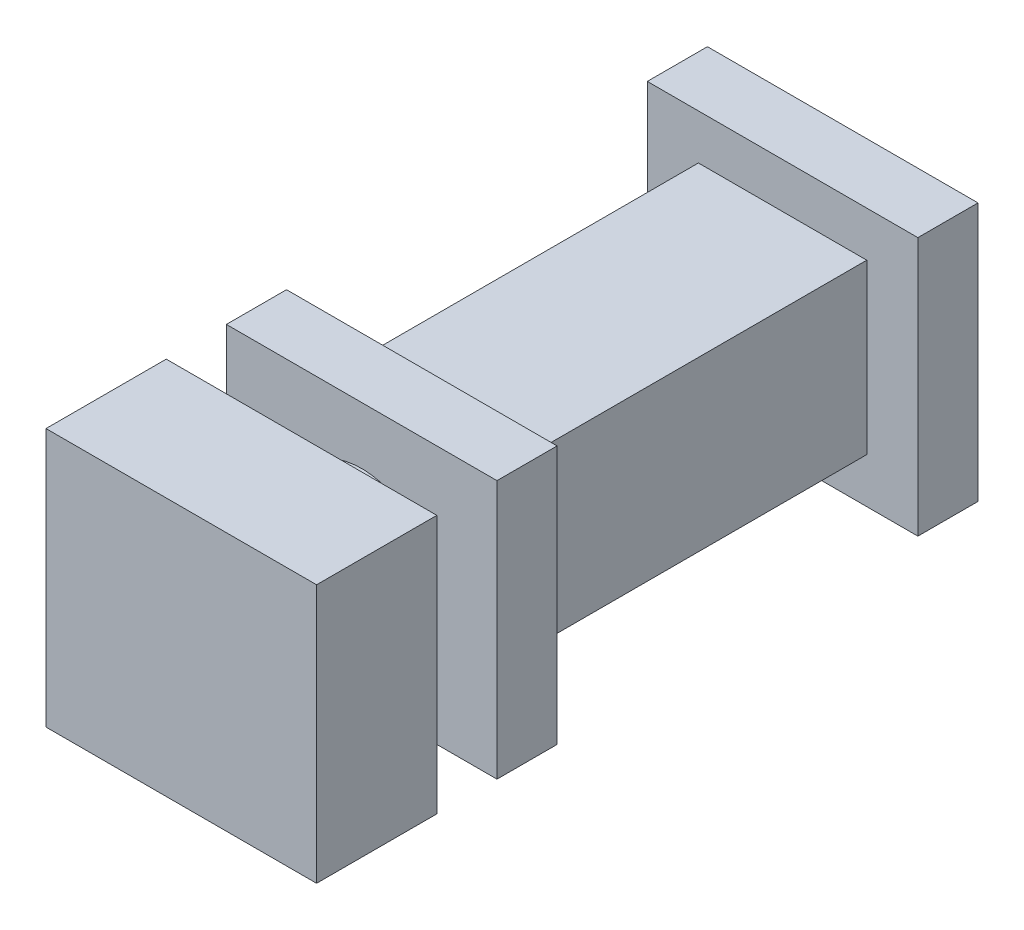
ISO-10303-21;
HEADER;
FILE_DESCRIPTION(('STEP AP214'),'2;1');
FILE_NAME('part.step','',(''),(''),'','','');
FILE_SCHEMA(('AUTOMOTIVE_DESIGN { 1 0 10303 214 1 1 1 1 }'));
ENDSEC;
DATA;
#1=APPLICATION_CONTEXT('core data for automotive mechanical design processes');
#2=APPLICATION_PROTOCOL_DEFINITION('international standard','automotive_design',2000,#1);
#3=PRODUCT_CONTEXT('',#1,'mechanical');
#4=PRODUCT('Part','Part','',(#3));
#5=PRODUCT_RELATED_PRODUCT_CATEGORY('part','',(#4));
#6=PRODUCT_DEFINITION_FORMATION('','',#4);
#7=PRODUCT_DEFINITION_CONTEXT('part definition',#1,'design');
#8=PRODUCT_DEFINITION('design','',#6,#7);
#9=PRODUCT_DEFINITION_SHAPE('','',#8);
#10=(LENGTH_UNIT() NAMED_UNIT(*) SI_UNIT(.MILLI.,.METRE.));
#11=(NAMED_UNIT(*) PLANE_ANGLE_UNIT() SI_UNIT($,.RADIAN.));
#12=(NAMED_UNIT(*) SI_UNIT($,.STERADIAN.) SOLID_ANGLE_UNIT());
#13=UNCERTAINTY_MEASURE_WITH_UNIT(LENGTH_MEASURE(1.E-05),#10,'distance_accuracy_value','');
#14=(GEOMETRIC_REPRESENTATION_CONTEXT(3) GLOBAL_UNCERTAINTY_ASSIGNED_CONTEXT((#13)) GLOBAL_UNIT_ASSIGNED_CONTEXT((#10,
#11,#12)) REPRESENTATION_CONTEXT('',''));
#15=CARTESIAN_POINT('',(0.,0.,0.));
#16=DIRECTION('',(0.,0.,1.));
#17=DIRECTION('',(1.,0.,0.));
#18=AXIS2_PLACEMENT_3D('',#15,#16,#17);
#19=CARTESIAN_POINT('',(0.,0.,-1.));
#20=DIRECTION('',(0.,0.,1.));
#21=DIRECTION('',(1.,0.,0.));
#22=AXIS2_PLACEMENT_3D('',#19,#20,#21);
#23=PLANE('',#22);
#24=DIRECTION('',(0.,1.,0.));
#25=VECTOR('',#24,1.);
#26=CARTESIAN_POINT('',(-1.125,-1.075,-1.));
#27=LINE('',#26,#25);
#28=CARTESIAN_POINT('',(-1.125,-1.075,-1.));
#29=VERTEX_POINT('',#28);
#30=CARTESIAN_POINT('',(-1.125,1.075,-1.));
#31=VERTEX_POINT('',#30);
#32=EDGE_CURVE('E230',#29,#31,#27,.T.);
#33=ORIENTED_EDGE('',*,*,#32,.T.);
#34=DIRECTION('',(1.,0.,0.));
#35=VECTOR('',#34,1.);
#36=CARTESIAN_POINT('',(1.125,1.075,-1.));
#37=LINE('',#36,#35);
#38=CARTESIAN_POINT('',(1.125,1.075,-1.));
#39=VERTEX_POINT('',#38);
#40=EDGE_CURVE('E234',#31,#39,#37,.T.);
#41=ORIENTED_EDGE('',*,*,#40,.T.);
#42=DIRECTION('',(0.,-1.,0.));
#43=VECTOR('',#42,1.);
#44=CARTESIAN_POINT('',(1.125,-1.075,-1.));
#45=LINE('',#44,#43);
#46=CARTESIAN_POINT('',(1.125,-1.075,-1.));
#47=VERTEX_POINT('',#46);
#48=EDGE_CURVE('E238',#39,#47,#45,.T.);
#49=ORIENTED_EDGE('',*,*,#48,.T.);
#50=DIRECTION('',(-1.,0.,0.));
#51=VECTOR('',#50,1.);
#52=CARTESIAN_POINT('',(1.125,-1.075,-1.));
#53=LINE('',#52,#51);
#54=EDGE_CURVE('E241',#47,#29,#53,.T.);
#55=ORIENTED_EDGE('',*,*,#54,.T.);
#56=EDGE_LOOP('',(#33,#41,#49,#55));
#57=FACE_BOUND('',#56,.T.);
#58=DIRECTION('',(0.,1.,0.));
#59=VECTOR('',#58,1.);
#60=CARTESIAN_POINT('',(-0.7,-0.7,-1.));
#61=LINE('',#60,#59);
#62=CARTESIAN_POINT('',(-0.7,-0.7,-1.));
#63=VERTEX_POINT('',#62);
#64=CARTESIAN_POINT('',(-0.7,0.7,-1.));
#65=VERTEX_POINT('',#64);
#66=EDGE_CURVE('E56',#63,#65,#61,.T.);
#67=ORIENTED_EDGE('',*,*,#66,.F.);
#68=DIRECTION('',(-1.,0.,0.));
#69=VECTOR('',#68,1.);
#70=CARTESIAN_POINT('',(0.7,-0.7,-1.));
#71=LINE('',#70,#69);
#72=CARTESIAN_POINT('',(0.7,-0.7,-1.));
#73=VERTEX_POINT('',#72);
#74=EDGE_CURVE('E60',#73,#63,#71,.T.);
#75=ORIENTED_EDGE('',*,*,#74,.F.);
#76=DIRECTION('',(0.,-1.,0.));
#77=VECTOR('',#76,1.);
#78=CARTESIAN_POINT('',(0.7,-0.7,-1.));
#79=LINE('',#78,#77);
#80=CARTESIAN_POINT('',(0.7,0.7,-1.));
#81=VERTEX_POINT('',#80);
#82=EDGE_CURVE('E209',#81,#73,#79,.T.);
#83=ORIENTED_EDGE('',*,*,#82,.F.);
#84=DIRECTION('',(1.,0.,0.));
#85=VECTOR('',#84,1.);
#86=CARTESIAN_POINT('',(0.7,0.7,-1.));
#87=LINE('',#86,#85);
#88=EDGE_CURVE('E183',#65,#81,#87,.T.);
#89=ORIENTED_EDGE('',*,*,#88,.F.);
#90=EDGE_LOOP('',(#67,#75,#83,#89));
#91=FACE_BOUND('',#90,.T.);
#92=ADVANCED_FACE('F39',(#57,#91),#23,.F.);
#93=CARTESIAN_POINT('',(1.125,-1.075,1.));
#94=DIRECTION('',(-1.,0.,0.));
#95=DIRECTION('',(0.,-1.,0.));
#96=AXIS2_PLACEMENT_3D('',#93,#94,#95);
#97=PLANE('',#96);
#98=DIRECTION('',(0.,1.,0.));
#99=VECTOR('',#98,1.);
#100=CARTESIAN_POINT('',(1.125,-1.075,0.));
#101=LINE('',#100,#99);
#102=CARTESIAN_POINT('',(1.125,-1.075,0.));
#103=VERTEX_POINT('',#102);
#104=CARTESIAN_POINT('',(1.125,1.075,0.));
#105=VERTEX_POINT('',#104);
#106=EDGE_CURVE('E274',#103,#105,#101,.T.);
#107=ORIENTED_EDGE('',*,*,#106,.T.);
#108=DIRECTION('',(0.,0.,-1.));
#109=VECTOR('',#108,1.);
#110=CARTESIAN_POINT('',(1.125,1.075,1.));
#111=LINE('',#110,#109);
#112=CARTESIAN_POINT('',(1.125,1.075,1.));
#113=VERTEX_POINT('',#112);
#114=EDGE_CURVE('E43',#113,#105,#111,.T.);
#115=ORIENTED_EDGE('',*,*,#114,.F.);
#116=DIRECTION('',(0.,1.,0.));
#117=VECTOR('',#116,1.);
#118=CARTESIAN_POINT('',(1.125,-1.075,1.));
#119=LINE('',#118,#117);
#120=CARTESIAN_POINT('',(1.125,-1.075,1.));
#121=VERTEX_POINT('',#120);
#122=EDGE_CURVE('E276',#121,#113,#119,.T.);
#123=ORIENTED_EDGE('',*,*,#122,.F.);
#124=DIRECTION('',(0.,0.,-1.));
#125=VECTOR('',#124,1.);
#126=CARTESIAN_POINT('',(1.125,-1.075,1.));
#127=LINE('',#126,#125);
#128=EDGE_CURVE('E290',#121,#103,#127,.T.);
#129=ORIENTED_EDGE('',*,*,#128,.T.);
#130=EDGE_LOOP('',(#107,#115,#123,#129));
#131=FACE_BOUND('',#130,.T.);
#132=ADVANCED_FACE('F41',(#131),#97,.F.);
#133=CARTESIAN_POINT('',(-1.125,1.075,1.));
#134=DIRECTION('',(0.,-1.,0.));
#135=DIRECTION('',(1.,0.,0.));
#136=AXIS2_PLACEMENT_3D('',#133,#134,#135);
#137=PLANE('',#136);
#138=DIRECTION('',(-1.,0.,0.));
#139=VECTOR('',#138,1.);
#140=CARTESIAN_POINT('',(-1.125,1.075,0.));
#141=LINE('',#140,#139);
#142=CARTESIAN_POINT('',(-1.125,1.075,0.));
#143=VERTEX_POINT('',#142);
#144=EDGE_CURVE('E294',#105,#143,#141,.T.);
#145=ORIENTED_EDGE('',*,*,#144,.T.);
#146=DIRECTION('',(0.,0.,-1.));
#147=VECTOR('',#146,1.);
#148=CARTESIAN_POINT('',(-1.125,1.075,1.));
#149=LINE('',#148,#147);
#150=CARTESIAN_POINT('',(-1.125,1.075,1.));
#151=VERTEX_POINT('',#150);
#152=EDGE_CURVE('E308',#151,#143,#149,.T.);
#153=ORIENTED_EDGE('',*,*,#152,.F.);
#154=DIRECTION('',(-1.,0.,0.));
#155=VECTOR('',#154,1.);
#156=CARTESIAN_POINT('',(-1.125,1.075,1.));
#157=LINE('',#156,#155);
#158=EDGE_CURVE('E280',#113,#151,#157,.T.);
#159=ORIENTED_EDGE('',*,*,#158,.F.);
#160=ORIENTED_EDGE('',*,*,#114,.T.);
#161=EDGE_LOOP('',(#145,#153,#159,#160));
#162=FACE_BOUND('',#161,.T.);
#163=ADVANCED_FACE('F319',(#162),#137,.F.);
#164=CARTESIAN_POINT('',(-1.125,-1.075,1.));
#165=DIRECTION('',(1.,0.,0.));
#166=DIRECTION('',(0.,0.,-1.));
#167=AXIS2_PLACEMENT_3D('',#164,#165,#166);
#168=PLANE('',#167);
#169=DIRECTION('',(0.,-1.,0.));
#170=VECTOR('',#169,1.);
#171=CARTESIAN_POINT('',(-1.125,-1.075,0.));
#172=LINE('',#171,#170);
#173=CARTESIAN_POINT('',(-1.125,-1.075,0.));
#174=VERTEX_POINT('',#173);
#175=EDGE_CURVE('E297',#143,#174,#172,.T.);
#176=ORIENTED_EDGE('',*,*,#175,.T.);
#177=DIRECTION('',(0.,0.,-1.));
#178=VECTOR('',#177,1.);
#179=CARTESIAN_POINT('',(-1.125,-1.075,1.));
#180=LINE('',#179,#178);
#181=CARTESIAN_POINT('',(-1.125,-1.075,1.));
#182=VERTEX_POINT('',#181);
#183=EDGE_CURVE('E305',#182,#174,#180,.T.);
#184=ORIENTED_EDGE('',*,*,#183,.F.);
#185=DIRECTION('',(0.,-1.,0.));
#186=VECTOR('',#185,1.);
#187=CARTESIAN_POINT('',(-1.125,-1.075,1.));
#188=LINE('',#187,#186);
#189=EDGE_CURVE('E284',#151,#182,#188,.T.);
#190=ORIENTED_EDGE('',*,*,#189,.F.);
#191=ORIENTED_EDGE('',*,*,#152,.T.);
#192=EDGE_LOOP('',(#176,#184,#190,#191));
#193=FACE_BOUND('',#192,.T.);
#194=ADVANCED_FACE('F328',(#193),#168,.F.);
#195=CARTESIAN_POINT('',(-1.125,-1.075,1.));
#196=DIRECTION('',(0.,1.,0.));
#197=DIRECTION('',(-1.,0.,0.));
#198=AXIS2_PLACEMENT_3D('',#195,#196,#197);
#199=PLANE('',#198);
#200=DIRECTION('',(1.,0.,0.));
#201=VECTOR('',#200,1.);
#202=CARTESIAN_POINT('',(-1.125,-1.075,0.));
#203=LINE('',#202,#201);
#204=EDGE_CURVE('E281',#174,#103,#203,.T.);
#205=ORIENTED_EDGE('',*,*,#204,.T.);
#206=ORIENTED_EDGE('',*,*,#128,.F.);
#207=DIRECTION('',(1.,0.,0.));
#208=VECTOR('',#207,1.);
#209=CARTESIAN_POINT('',(-1.125,-1.075,1.));
#210=LINE('',#209,#208);
#211=EDGE_CURVE('E287',#182,#121,#210,.T.);
#212=ORIENTED_EDGE('',*,*,#211,.F.);
#213=ORIENTED_EDGE('',*,*,#183,.T.);
#214=EDGE_LOOP('',(#205,#206,#212,#213));
#215=FACE_BOUND('',#214,.T.);
#216=ADVANCED_FACE('F331',(#215),#199,.F.);
#217=CARTESIAN_POINT('',(0.,0.,1.));
#218=DIRECTION('',(0.,0.,-1.));
#219=DIRECTION('',(-1.,0.,0.));
#220=AXIS2_PLACEMENT_3D('',#217,#218,#219);
#221=PLANE('',#220);
#222=ORIENTED_EDGE('',*,*,#122,.T.);
#223=ORIENTED_EDGE('',*,*,#158,.T.);
#224=ORIENTED_EDGE('',*,*,#189,.T.);
#225=ORIENTED_EDGE('',*,*,#211,.T.);
#226=EDGE_LOOP('',(#222,#223,#224,#225));
#227=FACE_BOUND('',#226,.T.);
#228=ADVANCED_FACE('F333',(#227),#221,.F.);
#229=CARTESIAN_POINT('',(0.,0.,0.));
#230=DIRECTION('',(0.,0.,-1.));
#231=DIRECTION('',(-1.,0.,0.));
#232=AXIS2_PLACEMENT_3D('',#229,#230,#231);
#233=PLANE('',#232);
#234=CARTESIAN_POINT('',(0.,0.,0.));
#235=DIRECTION('',(0.,0.,-1.));
#236=DIRECTION('',(-1.,0.,0.));
#237=AXIS2_PLACEMENT_3D('',#234,#235,#236);
#238=CIRCLE('',#237,0.6);
#239=CARTESIAN_POINT('',(-0.6,0.,0.));
#240=VERTEX_POINT('',#239);
#241=EDGE_CURVE('E11',#240,#240,#238,.T.);
#242=ORIENTED_EDGE('',*,*,#241,.F.);
#243=EDGE_LOOP('',(#242));
#244=FACE_BOUND('',#243,.T.);
#245=ORIENTED_EDGE('',*,*,#106,.F.);
#246=ORIENTED_EDGE('',*,*,#204,.F.);
#247=ORIENTED_EDGE('',*,*,#175,.F.);
#248=ORIENTED_EDGE('',*,*,#144,.F.);
#249=EDGE_LOOP('',(#245,#246,#247,#248));
#250=FACE_BOUND('',#249,.T.);
#251=ADVANCED_FACE('F326',(#244,#250),#233,.T.);
#252=CARTESIAN_POINT('',(0.,0.,-0.5));
#253=DIRECTION('',(0.,0.,1.));
#254=DIRECTION('',(1.,0.,0.));
#255=AXIS2_PLACEMENT_3D('',#252,#253,#254);
#256=CYLINDRICAL_SURFACE('',#255,0.6);
#257=CARTESIAN_POINT('',(0.,0.,-0.5));
#258=DIRECTION('',(0.,0.,-1.));
#259=DIRECTION('',(-1.,0.,0.));
#260=AXIS2_PLACEMENT_3D('',#257,#258,#259);
#261=CIRCLE('',#260,0.6);
#262=CARTESIAN_POINT('',(-0.6,0.,-0.5));
#263=VERTEX_POINT('',#262);
#264=EDGE_CURVE('E271',#263,#263,#261,.T.);
#265=ORIENTED_EDGE('',*,*,#264,.F.);
#266=EDGE_LOOP('',(#265));
#267=FACE_BOUND('',#266,.T.);
#268=ORIENTED_EDGE('',*,*,#241,.T.);
#269=EDGE_LOOP('',(#268));
#270=FACE_BOUND('',#269,.T.);
#271=ADVANCED_FACE('F340',(#267,#270),#256,.T.);
#272=CARTESIAN_POINT('',(-1.125,-1.075,-1.));
#273=DIRECTION('',(1.,0.,0.));
#274=DIRECTION('',(0.,1.,0.));
#275=AXIS2_PLACEMENT_3D('',#272,#273,#274);
#276=PLANE('',#275);
#277=DIRECTION('',(0.,1.,0.));
#278=VECTOR('',#277,1.);
#279=CARTESIAN_POINT('',(-1.125,-1.075,-0.5));
#280=LINE('',#279,#278);
#281=CARTESIAN_POINT('',(-1.125,-1.075,-0.5));
#282=VERTEX_POINT('',#281);
#283=CARTESIAN_POINT('',(-1.125,1.075,-0.5));
#284=VERTEX_POINT('',#283);
#285=EDGE_CURVE('E229',#282,#284,#280,.T.);
#286=ORIENTED_EDGE('',*,*,#285,.T.);
#287=DIRECTION('',(0.,0.,1.));
#288=VECTOR('',#287,1.);
#289=CARTESIAN_POINT('',(-1.125,1.075,-1.));
#290=LINE('',#289,#288);
#291=EDGE_CURVE('E267',#31,#284,#290,.T.);
#292=ORIENTED_EDGE('',*,*,#291,.F.);
#293=ORIENTED_EDGE('',*,*,#32,.F.);
#294=DIRECTION('',(0.,0.,1.));
#295=VECTOR('',#294,1.);
#296=CARTESIAN_POINT('',(-1.125,-1.075,-1.));
#297=LINE('',#296,#295);
#298=EDGE_CURVE('E244',#29,#282,#297,.T.);
#299=ORIENTED_EDGE('',*,*,#298,.T.);
#300=EDGE_LOOP('',(#286,#292,#293,#299));
#301=FACE_BOUND('',#300,.T.);
#302=ADVANCED_FACE('F370',(#301),#276,.F.);
#303=CARTESIAN_POINT('',(1.125,1.075,-1.));
#304=DIRECTION('',(0.,-1.,0.));
#305=DIRECTION('',(0.,0.,-1.));
#306=AXIS2_PLACEMENT_3D('',#303,#304,#305);
#307=PLANE('',#306);
#308=DIRECTION('',(1.,0.,0.));
#309=VECTOR('',#308,1.);
#310=CARTESIAN_POINT('',(1.125,1.075,-0.5));
#311=LINE('',#310,#309);
#312=CARTESIAN_POINT('',(1.125,1.075,-0.5));
#313=VERTEX_POINT('',#312);
#314=EDGE_CURVE('E248',#284,#313,#311,.T.);
#315=ORIENTED_EDGE('',*,*,#314,.T.);
#316=DIRECTION('',(0.,0.,1.));
#317=VECTOR('',#316,1.);
#318=CARTESIAN_POINT('',(1.125,1.075,-1.));
#319=LINE('',#318,#317);
#320=EDGE_CURVE('E263',#39,#313,#319,.T.);
#321=ORIENTED_EDGE('',*,*,#320,.F.);
#322=ORIENTED_EDGE('',*,*,#40,.F.);
#323=ORIENTED_EDGE('',*,*,#291,.T.);
#324=EDGE_LOOP('',(#315,#321,#322,#323));
#325=FACE_BOUND('',#324,.T.);
#326=ADVANCED_FACE('F366',(#325),#307,.F.);
#327=CARTESIAN_POINT('',(1.125,-1.075,-1.));
#328=DIRECTION('',(-1.,0.,0.));
#329=DIRECTION('',(0.,-1.,0.));
#330=AXIS2_PLACEMENT_3D('',#327,#328,#329);
#331=PLANE('',#330);
#332=DIRECTION('',(0.,-1.,0.));
#333=VECTOR('',#332,1.);
#334=CARTESIAN_POINT('',(1.125,-1.075,-0.5));
#335=LINE('',#334,#333);
#336=CARTESIAN_POINT('',(1.125,-1.075,-0.5));
#337=VERTEX_POINT('',#336);
#338=EDGE_CURVE('E251',#313,#337,#335,.T.);
#339=ORIENTED_EDGE('',*,*,#338,.T.);
#340=DIRECTION('',(0.,0.,1.));
#341=VECTOR('',#340,1.);
#342=CARTESIAN_POINT('',(1.125,-1.075,-1.));
#343=LINE('',#342,#341);
#344=EDGE_CURVE('E259',#47,#337,#343,.T.);
#345=ORIENTED_EDGE('',*,*,#344,.F.);
#346=ORIENTED_EDGE('',*,*,#48,.F.);
#347=ORIENTED_EDGE('',*,*,#320,.T.);
#348=EDGE_LOOP('',(#339,#345,#346,#347));
#349=FACE_BOUND('',#348,.T.);
#350=ADVANCED_FACE('F362',(#349),#331,.F.);
#351=CARTESIAN_POINT('',(1.125,-1.075,-1.));
#352=DIRECTION('',(0.,1.,0.));
#353=DIRECTION('',(0.,0.,1.));
#354=AXIS2_PLACEMENT_3D('',#351,#352,#353);
#355=PLANE('',#354);
#356=DIRECTION('',(-1.,0.,0.));
#357=VECTOR('',#356,1.);
#358=CARTESIAN_POINT('',(1.125,-1.075,-0.5));
#359=LINE('',#358,#357);
#360=EDGE_CURVE('E235',#337,#282,#359,.T.);
#361=ORIENTED_EDGE('',*,*,#360,.T.);
#362=ORIENTED_EDGE('',*,*,#298,.F.);
#363=ORIENTED_EDGE('',*,*,#54,.F.);
#364=ORIENTED_EDGE('',*,*,#344,.T.);
#365=EDGE_LOOP('',(#361,#362,#363,#364));
#366=FACE_BOUND('',#365,.T.);
#367=ADVANCED_FACE('F358',(#366),#355,.F.);
#368=CARTESIAN_POINT('',(0.,0.,-0.5));
#369=DIRECTION('',(0.,0.,1.));
#370=DIRECTION('',(1.,0.,0.));
#371=AXIS2_PLACEMENT_3D('',#368,#369,#370);
#372=PLANE('',#371);
#373=ORIENTED_EDGE('',*,*,#264,.T.);
#374=EDGE_LOOP('',(#373));
#375=FACE_BOUND('',#374,.T.);
#376=ORIENTED_EDGE('',*,*,#285,.F.);
#377=ORIENTED_EDGE('',*,*,#360,.F.);
#378=ORIENTED_EDGE('',*,*,#338,.F.);
#379=ORIENTED_EDGE('',*,*,#314,.F.);
#380=EDGE_LOOP('',(#376,#377,#378,#379));
#381=FACE_BOUND('',#380,.T.);
#382=ADVANCED_FACE('F355',(#375,#381),#372,.T.);
#383=CARTESIAN_POINT('',(-0.7,-0.7,-4.));
#384=DIRECTION('',(1.,0.,0.));
#385=DIRECTION('',(0.,0.,-1.));
#386=AXIS2_PLACEMENT_3D('',#383,#384,#385);
#387=PLANE('',#386);
#388=ORIENTED_EDGE('',*,*,#66,.T.);
#389=DIRECTION('',(0.,0.,1.));
#390=VECTOR('',#389,1.);
#391=CARTESIAN_POINT('',(-0.7,0.7,-4.));
#392=LINE('',#391,#390);
#393=CARTESIAN_POINT('',(-0.7,0.7,-4.));
#394=VERTEX_POINT('',#393);
#395=EDGE_CURVE('E225',#394,#65,#392,.T.);
#396=ORIENTED_EDGE('',*,*,#395,.F.);
#397=DIRECTION('',(0.,1.,0.));
#398=VECTOR('',#397,1.);
#399=CARTESIAN_POINT('',(-0.7,-0.7,-4.));
#400=LINE('',#399,#398);
#401=CARTESIAN_POINT('',(-0.7,-0.7,-4.));
#402=VERTEX_POINT('',#401);
#403=EDGE_CURVE('E189',#402,#394,#400,.T.);
#404=ORIENTED_EDGE('',*,*,#403,.F.);
#405=DIRECTION('',(0.,0.,1.));
#406=VECTOR('',#405,1.);
#407=CARTESIAN_POINT('',(-0.7,-0.7,-4.));
#408=LINE('',#407,#406);
#409=EDGE_CURVE('E204',#402,#63,#408,.T.);
#410=ORIENTED_EDGE('',*,*,#409,.T.);
#411=EDGE_LOOP('',(#388,#396,#404,#410));
#412=FACE_BOUND('',#411,.T.);
#413=ADVANCED_FACE('F353',(#412),#387,.F.);
#414=CARTESIAN_POINT('',(0.7,0.7,-4.));
#415=DIRECTION('',(0.,-1.,0.));
#416=DIRECTION('',(1.,0.,0.));
#417=AXIS2_PLACEMENT_3D('',#414,#415,#416);
#418=PLANE('',#417);
#419=ORIENTED_EDGE('',*,*,#88,.T.);
#420=DIRECTION('',(0.,0.,1.));
#421=VECTOR('',#420,1.);
#422=CARTESIAN_POINT('',(0.7,0.7,-4.));
#423=LINE('',#422,#421);
#424=CARTESIAN_POINT('',(0.7,0.7,-4.));
#425=VERTEX_POINT('',#424);
#426=EDGE_CURVE('E221',#425,#81,#423,.T.);
#427=ORIENTED_EDGE('',*,*,#426,.F.);
#428=DIRECTION('',(1.,0.,0.));
#429=VECTOR('',#428,1.);
#430=CARTESIAN_POINT('',(0.7,0.7,-4.));
#431=LINE('',#430,#429);
#432=EDGE_CURVE('E193',#394,#425,#431,.T.);
#433=ORIENTED_EDGE('',*,*,#432,.F.);
#434=ORIENTED_EDGE('',*,*,#395,.T.);
#435=EDGE_LOOP('',(#419,#427,#433,#434));
#436=FACE_BOUND('',#435,.T.);
#437=ADVANCED_FACE('F420',(#436),#418,.F.);
#438=CARTESIAN_POINT('',(0.7,-0.7,-4.));
#439=DIRECTION('',(-1.,0.,0.));
#440=DIRECTION('',(0.,0.,1.));
#441=AXIS2_PLACEMENT_3D('',#438,#439,#440);
#442=PLANE('',#441);
#443=ORIENTED_EDGE('',*,*,#82,.T.);
#444=DIRECTION('',(0.,0.,1.));
#445=VECTOR('',#444,1.);
#446=CARTESIAN_POINT('',(0.7,-0.7,-4.));
#447=LINE('',#446,#445);
#448=CARTESIAN_POINT('',(0.7,-0.7,-4.));
#449=VERTEX_POINT('',#448);
#450=EDGE_CURVE('E217',#449,#73,#447,.T.);
#451=ORIENTED_EDGE('',*,*,#450,.F.);
#452=DIRECTION('',(0.,-1.,0.));
#453=VECTOR('',#452,1.);
#454=CARTESIAN_POINT('',(0.7,-0.7,-4.));
#455=LINE('',#454,#453);
#456=EDGE_CURVE('E197',#425,#449,#455,.T.);
#457=ORIENTED_EDGE('',*,*,#456,.F.);
#458=ORIENTED_EDGE('',*,*,#426,.T.);
#459=EDGE_LOOP('',(#443,#451,#457,#458));
#460=FACE_BOUND('',#459,.T.);
#461=ADVANCED_FACE('F427',(#460),#442,.F.);
#462=CARTESIAN_POINT('',(0.7,-0.7,-4.));
#463=DIRECTION('',(0.,1.,0.));
#464=DIRECTION('',(-1.,0.,0.));
#465=AXIS2_PLACEMENT_3D('',#462,#463,#464);
#466=PLANE('',#465);
#467=ORIENTED_EDGE('',*,*,#74,.T.);
#468=ORIENTED_EDGE('',*,*,#409,.F.);
#469=DIRECTION('',(-1.,0.,0.));
#470=VECTOR('',#469,1.);
#471=CARTESIAN_POINT('',(0.7,-0.7,-4.));
#472=LINE('',#471,#470);
#473=EDGE_CURVE('E201',#449,#402,#472,.T.);
#474=ORIENTED_EDGE('',*,*,#473,.F.);
#475=ORIENTED_EDGE('',*,*,#450,.T.);
#476=EDGE_LOOP('',(#467,#468,#474,#475));
#477=FACE_BOUND('',#476,.T.);
#478=ADVANCED_FACE('F434',(#477),#466,.F.);
#479=CARTESIAN_POINT('',(-1.125,-1.075,-4.5));
#480=DIRECTION('',(1.,0.,0.));
#481=DIRECTION('',(0.,0.,-1.));
#482=AXIS2_PLACEMENT_3D('',#479,#480,#481);
#483=PLANE('',#482);
#484=DIRECTION('',(0.,1.,0.));
#485=VECTOR('',#484,1.);
#486=CARTESIAN_POINT('',(-1.125,-1.075,-4.));
#487=LINE('',#486,#485);
#488=CARTESIAN_POINT('',(-1.125,-1.075,-4.));
#489=VERTEX_POINT('',#488);
#490=CARTESIAN_POINT('',(-1.125,1.075,-4.));
#491=VERTEX_POINT('',#490);
#492=EDGE_CURVE('E178',#489,#491,#487,.T.);
#493=ORIENTED_EDGE('',*,*,#492,.T.);
#494=DIRECTION('',(0.,0.,1.));
#495=VECTOR('',#494,1.);
#496=CARTESIAN_POINT('',(-1.125,1.075,-4.5));
#497=LINE('',#496,#495);
#498=CARTESIAN_POINT('',(-1.125,1.075,-4.5));
#499=VERTEX_POINT('',#498);
#500=EDGE_CURVE('E156',#499,#491,#497,.T.);
#501=ORIENTED_EDGE('',*,*,#500,.F.);
#502=DIRECTION('',(0.,1.,0.));
#503=VECTOR('',#502,1.);
#504=CARTESIAN_POINT('',(-1.125,-1.075,-4.5));
#505=LINE('',#504,#503);
#506=CARTESIAN_POINT('',(-1.125,-1.075,-4.5));
#507=VERTEX_POINT('',#506);
#508=EDGE_CURVE('E164',#507,#499,#505,.T.);
#509=ORIENTED_EDGE('',*,*,#508,.F.);
#510=DIRECTION('',(0.,0.,1.));
#511=VECTOR('',#510,1.);
#512=CARTESIAN_POINT('',(-1.125,-1.075,-4.5));
#513=LINE('',#512,#511);
#514=EDGE_CURVE('E575',#507,#489,#513,.T.);
#515=ORIENTED_EDGE('',*,*,#514,.T.);
#516=EDGE_LOOP('',(#493,#501,#509,#515));
#517=FACE_BOUND('',#516,.T.);
#518=ADVANCED_FACE('F176',(#517),#483,.F.);
#519=CARTESIAN_POINT('',(1.125,1.075,-4.5));
#520=DIRECTION('',(0.,-1.,0.));
#521=DIRECTION('',(0.,0.,-1.));
#522=AXIS2_PLACEMENT_3D('',#519,#520,#521);
#523=PLANE('',#522);
#524=DIRECTION('',(1.,0.,0.));
#525=VECTOR('',#524,1.);
#526=CARTESIAN_POINT('',(1.125,1.075,-4.));
#527=LINE('',#526,#525);
#528=CARTESIAN_POINT('',(1.125,1.075,-4.));
#529=VERTEX_POINT('',#528);
#530=EDGE_CURVE('E562',#491,#529,#527,.T.);
#531=ORIENTED_EDGE('',*,*,#530,.T.);
#532=DIRECTION('',(0.,0.,1.));
#533=VECTOR('',#532,1.);
#534=CARTESIAN_POINT('',(1.125,1.075,-4.5));
#535=LINE('',#534,#533);
#536=CARTESIAN_POINT('',(1.125,1.075,-4.5));
#537=VERTEX_POINT('',#536);
#538=EDGE_CURVE('E159',#537,#529,#535,.T.);
#539=ORIENTED_EDGE('',*,*,#538,.F.);
#540=DIRECTION('',(1.,0.,0.));
#541=VECTOR('',#540,1.);
#542=CARTESIAN_POINT('',(1.125,1.075,-4.5));
#543=LINE('',#542,#541);
#544=EDGE_CURVE('E152',#499,#537,#543,.T.);
#545=ORIENTED_EDGE('',*,*,#544,.F.);
#546=ORIENTED_EDGE('',*,*,#500,.T.);
#547=EDGE_LOOP('',(#531,#539,#545,#546));
#548=FACE_BOUND('',#547,.T.);
#549=ADVANCED_FACE('F154',(#548),#523,.F.);
#550=CARTESIAN_POINT('',(1.125,-1.075,-4.5));
#551=DIRECTION('',(-1.,0.,0.));
#552=DIRECTION('',(0.,0.,1.));
#553=AXIS2_PLACEMENT_3D('',#550,#551,#552);
#554=PLANE('',#553);
#555=DIRECTION('',(0.,-1.,0.));
#556=VECTOR('',#555,1.);
#557=CARTESIAN_POINT('',(1.125,-1.075,-4.));
#558=LINE('',#557,#556);
#559=CARTESIAN_POINT('',(1.125,-1.075,-4.));
#560=VERTEX_POINT('',#559);
#561=EDGE_CURVE('E566',#529,#560,#558,.T.);
#562=ORIENTED_EDGE('',*,*,#561,.T.);
#563=DIRECTION('',(0.,0.,1.));
#564=VECTOR('',#563,1.);
#565=CARTESIAN_POINT('',(1.125,-1.075,-4.5));
#566=LINE('',#565,#564);
#567=CARTESIAN_POINT('',(1.125,-1.075,-4.5));
#568=VERTEX_POINT('',#567);
#569=EDGE_CURVE('E185',#568,#560,#566,.T.);
#570=ORIENTED_EDGE('',*,*,#569,.F.);
#571=DIRECTION('',(0.,-1.,0.));
#572=VECTOR('',#571,1.);
#573=CARTESIAN_POINT('',(1.125,-1.075,-4.5));
#574=LINE('',#573,#572);
#575=EDGE_CURVE('E163',#537,#568,#574,.T.);
#576=ORIENTED_EDGE('',*,*,#575,.F.);
#577=ORIENTED_EDGE('',*,*,#538,.T.);
#578=EDGE_LOOP('',(#562,#570,#576,#577));
#579=FACE_BOUND('',#578,.T.);
#580=ADVANCED_FACE('F455',(#579),#554,.F.);
#581=CARTESIAN_POINT('',(1.125,-1.075,-4.5));
#582=DIRECTION('',(0.,1.,0.));
#583=DIRECTION('',(0.,0.,1.));
#584=AXIS2_PLACEMENT_3D('',#581,#582,#583);
#585=PLANE('',#584);
#586=DIRECTION('',(-1.,0.,0.));
#587=VECTOR('',#586,1.);
#588=CARTESIAN_POINT('',(1.125,-1.075,-4.));
#589=LINE('',#588,#587);
#590=EDGE_CURVE('E174',#560,#489,#589,.T.);
#591=ORIENTED_EDGE('',*,*,#590,.T.);
#592=ORIENTED_EDGE('',*,*,#514,.F.);
#593=DIRECTION('',(-1.,0.,0.));
#594=VECTOR('',#593,1.);
#595=CARTESIAN_POINT('',(1.125,-1.075,-4.5));
#596=LINE('',#595,#594);
#597=EDGE_CURVE('E169',#568,#507,#596,.T.);
#598=ORIENTED_EDGE('',*,*,#597,.F.);
#599=ORIENTED_EDGE('',*,*,#569,.T.);
#600=EDGE_LOOP('',(#591,#592,#598,#599));
#601=FACE_BOUND('',#600,.T.);
#602=ADVANCED_FACE('F462',(#601),#585,.F.);
#603=CARTESIAN_POINT('',(0.,0.,-4.5));
#604=DIRECTION('',(0.,0.,1.));
#605=DIRECTION('',(1.,0.,0.));
#606=AXIS2_PLACEMENT_3D('',#603,#604,#605);
#607=PLANE('',#606);
#608=ORIENTED_EDGE('',*,*,#508,.T.);
#609=ORIENTED_EDGE('',*,*,#544,.T.);
#610=ORIENTED_EDGE('',*,*,#575,.T.);
#611=ORIENTED_EDGE('',*,*,#597,.T.);
#612=EDGE_LOOP('',(#608,#609,#610,#611));
#613=FACE_BOUND('',#612,.T.);
#614=ADVANCED_FACE('F167',(#613),#607,.F.);
#615=CARTESIAN_POINT('',(0.,0.,-4.));
#616=DIRECTION('',(0.,0.,1.));
#617=DIRECTION('',(1.,0.,0.));
#618=AXIS2_PLACEMENT_3D('',#615,#616,#617);
#619=PLANE('',#618);
#620=ORIENTED_EDGE('',*,*,#473,.T.);
#621=ORIENTED_EDGE('',*,*,#403,.T.);
#622=ORIENTED_EDGE('',*,*,#432,.T.);
#623=ORIENTED_EDGE('',*,*,#456,.T.);
#624=EDGE_LOOP('',(#620,#621,#622,#623));
#625=FACE_BOUND('',#624,.T.);
#626=ORIENTED_EDGE('',*,*,#492,.F.);
#627=ORIENTED_EDGE('',*,*,#590,.F.);
#628=ORIENTED_EDGE('',*,*,#561,.F.);
#629=ORIENTED_EDGE('',*,*,#530,.F.);
#630=EDGE_LOOP('',(#626,#627,#628,#629));
#631=FACE_BOUND('',#630,.T.);
#632=ADVANCED_FACE('F477',(#625,#631),#619,.T.);
#633=CLOSED_SHELL('',(#92,#132,#163,#194,#216,#228,#251,#271,#302,#326,#350,#367,#382,#413,#437,
#461,#478,#518,#549,#580,#602,#614,#632));
#634=MANIFOLD_SOLID_BREP('B2',#633);
#635=ADVANCED_BREP_SHAPE_REPRESENTATION('',(#18,#634),#14);
#636=SHAPE_DEFINITION_REPRESENTATION(#9,#635);
ENDSEC;
END-ISO-10303-21;
